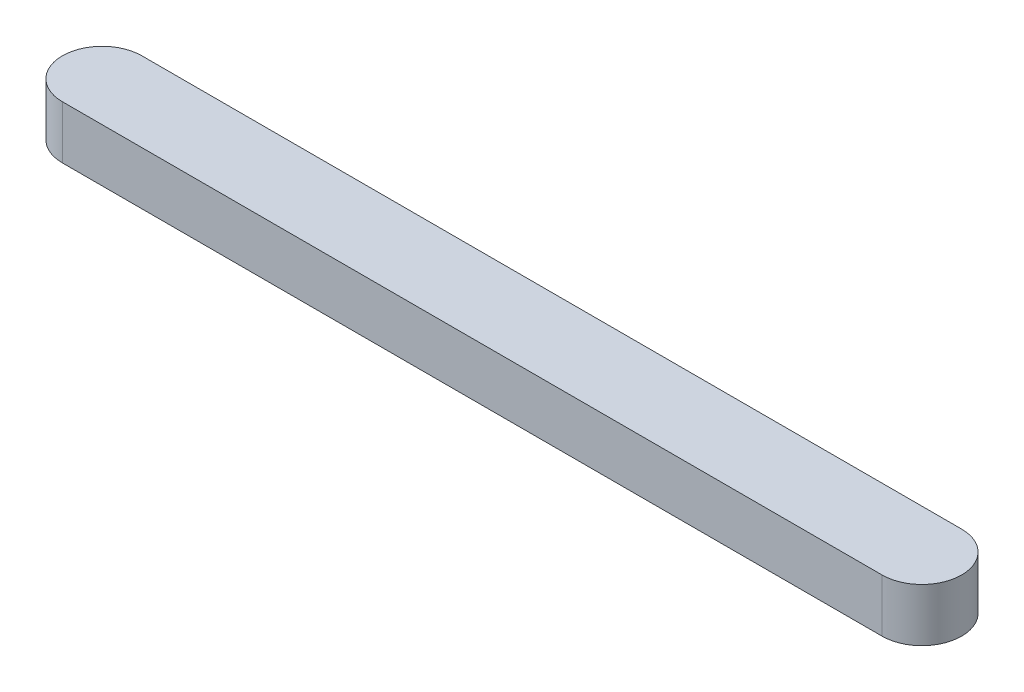
ISO-10303-21;
HEADER;
FILE_DESCRIPTION(('STEP AP214'),'2;1');
FILE_NAME('part.step','',(''),(''),'','','');
FILE_SCHEMA(('AUTOMOTIVE_DESIGN { 1 0 10303 214 1 1 1 1 }'));
ENDSEC;
DATA;
#1=APPLICATION_CONTEXT('core data for automotive mechanical design processes');
#2=APPLICATION_PROTOCOL_DEFINITION('international standard','automotive_design',2000,#1);
#3=PRODUCT_CONTEXT('',#1,'mechanical');
#4=PRODUCT('Part','Part','',(#3));
#5=PRODUCT_RELATED_PRODUCT_CATEGORY('part','',(#4));
#6=PRODUCT_DEFINITION_FORMATION('','',#4);
#7=PRODUCT_DEFINITION_CONTEXT('part definition',#1,'design');
#8=PRODUCT_DEFINITION('design','',#6,#7);
#9=PRODUCT_DEFINITION_SHAPE('','',#8);
#10=(LENGTH_UNIT() NAMED_UNIT(*) SI_UNIT(.MILLI.,.METRE.));
#11=(NAMED_UNIT(*) PLANE_ANGLE_UNIT() SI_UNIT($,.RADIAN.));
#12=(NAMED_UNIT(*) SI_UNIT($,.STERADIAN.) SOLID_ANGLE_UNIT());
#13=UNCERTAINTY_MEASURE_WITH_UNIT(LENGTH_MEASURE(1.E-05),#10,'distance_accuracy_value','');
#14=(GEOMETRIC_REPRESENTATION_CONTEXT(3) GLOBAL_UNCERTAINTY_ASSIGNED_CONTEXT((#13)) GLOBAL_UNIT_ASSIGNED_CONTEXT((#10,
#11,#12)) REPRESENTATION_CONTEXT('',''));
#15=CARTESIAN_POINT('',(0.,0.,0.));
#16=DIRECTION('',(0.,0.,1.));
#17=DIRECTION('',(1.,0.,0.));
#18=AXIS2_PLACEMENT_3D('',#15,#16,#17);
#19=CARTESIAN_POINT('',(-30.925,4.,0.));
#20=DIRECTION('',(0.,-1.,0.));
#21=DIRECTION('',(0.,0.,-1.));
#22=AXIS2_PLACEMENT_3D('',#19,#20,#21);
#23=CYLINDRICAL_SURFACE('',#22,3.);
#24=CARTESIAN_POINT('',(-30.925,0.,0.));
#25=DIRECTION('',(0.,1.,0.));
#26=DIRECTION('',(0.,0.,1.));
#27=AXIS2_PLACEMENT_3D('',#24,#25,#26);
#28=CIRCLE('',#27,3.);
#29=CARTESIAN_POINT('',(-30.925,0.,-3.));
#30=VERTEX_POINT('',#29);
#31=CARTESIAN_POINT('',(-30.925,0.,3.));
#32=VERTEX_POINT('',#31);
#33=EDGE_CURVE('E107',#30,#32,#28,.T.);
#34=ORIENTED_EDGE('',*,*,#33,.T.);
#35=DIRECTION('',(0.,-1.,0.));
#36=VECTOR('',#35,1.);
#37=CARTESIAN_POINT('',(-30.925,4.,3.));
#38=LINE('',#37,#36);
#39=CARTESIAN_POINT('',(-30.925,4.,3.));
#40=VERTEX_POINT('',#39);
#41=EDGE_CURVE('E11',#40,#32,#38,.T.);
#42=ORIENTED_EDGE('',*,*,#41,.F.);
#43=CARTESIAN_POINT('',(-30.925,4.,0.));
#44=DIRECTION('',(0.,1.,0.));
#45=DIRECTION('',(0.,0.,1.));
#46=AXIS2_PLACEMENT_3D('',#43,#44,#45);
#47=CIRCLE('',#46,3.);
#48=CARTESIAN_POINT('',(-30.925,4.,-3.));
#49=VERTEX_POINT('',#48);
#50=EDGE_CURVE('E91',#49,#40,#47,.T.);
#51=ORIENTED_EDGE('',*,*,#50,.F.);
#52=DIRECTION('',(0.,-1.,0.));
#53=VECTOR('',#52,1.);
#54=CARTESIAN_POINT('',(-30.925,4.,-3.));
#55=LINE('',#54,#53);
#56=EDGE_CURVE('E103',#49,#30,#55,.T.);
#57=ORIENTED_EDGE('',*,*,#56,.T.);
#58=EDGE_LOOP('',(#34,#42,#51,#57));
#59=FACE_BOUND('',#58,.T.);
#60=ADVANCED_FACE('F39',(#59),#23,.T.);
#61=CARTESIAN_POINT('',(-30.925,4.,3.));
#62=DIRECTION('',(0.,0.,-1.));
#63=DIRECTION('',(-1.,0.,0.));
#64=AXIS2_PLACEMENT_3D('',#61,#62,#63);
#65=PLANE('',#64);
#66=DIRECTION('',(1.,0.,0.));
#67=VECTOR('',#66,1.);
#68=CARTESIAN_POINT('',(-30.925,0.,3.));
#69=LINE('',#68,#67);
#70=CARTESIAN_POINT('',(30.925,0.,3.));
#71=VERTEX_POINT('',#70);
#72=EDGE_CURVE('E96',#32,#71,#69,.T.);
#73=ORIENTED_EDGE('',*,*,#72,.T.);
#74=DIRECTION('',(0.,-1.,0.));
#75=VECTOR('',#74,1.);
#76=CARTESIAN_POINT('',(30.925,4.,3.));
#77=LINE('',#76,#75);
#78=CARTESIAN_POINT('',(30.925,4.,3.));
#79=VERTEX_POINT('',#78);
#80=EDGE_CURVE('E48',#79,#71,#77,.T.);
#81=ORIENTED_EDGE('',*,*,#80,.F.);
#82=DIRECTION('',(1.,0.,0.));
#83=VECTOR('',#82,1.);
#84=CARTESIAN_POINT('',(-30.925,4.,3.));
#85=LINE('',#84,#83);
#86=EDGE_CURVE('E86',#40,#79,#85,.T.);
#87=ORIENTED_EDGE('',*,*,#86,.F.);
#88=ORIENTED_EDGE('',*,*,#41,.T.);
#89=EDGE_LOOP('',(#73,#81,#87,#88));
#90=FACE_BOUND('',#89,.T.);
#91=ADVANCED_FACE('F95',(#90),#65,.F.);
#92=CARTESIAN_POINT('',(30.925,4.,0.));
#93=DIRECTION('',(0.,-1.,0.));
#94=DIRECTION('',(0.,0.,-1.));
#95=AXIS2_PLACEMENT_3D('',#92,#93,#94);
#96=CYLINDRICAL_SURFACE('',#95,3.);
#97=CARTESIAN_POINT('',(30.925,0.,0.));
#98=DIRECTION('',(0.,1.,0.));
#99=DIRECTION('',(0.,0.,1.));
#100=AXIS2_PLACEMENT_3D('',#97,#98,#99);
#101=CIRCLE('',#100,3.);
#102=CARTESIAN_POINT('',(30.925,0.,-3.));
#103=VERTEX_POINT('',#102);
#104=EDGE_CURVE('E73',#71,#103,#101,.T.);
#105=ORIENTED_EDGE('',*,*,#104,.T.);
#106=DIRECTION('',(0.,-1.,0.));
#107=VECTOR('',#106,1.);
#108=CARTESIAN_POINT('',(30.925,4.,-3.));
#109=LINE('',#108,#107);
#110=CARTESIAN_POINT('',(30.925,4.,-3.));
#111=VERTEX_POINT('',#110);
#112=EDGE_CURVE('E98',#111,#103,#109,.T.);
#113=ORIENTED_EDGE('',*,*,#112,.F.);
#114=CARTESIAN_POINT('',(30.925,4.,0.));
#115=DIRECTION('',(0.,1.,0.));
#116=DIRECTION('',(0.,0.,1.));
#117=AXIS2_PLACEMENT_3D('',#114,#115,#116);
#118=CIRCLE('',#117,3.);
#119=EDGE_CURVE('E89',#79,#111,#118,.T.);
#120=ORIENTED_EDGE('',*,*,#119,.F.);
#121=ORIENTED_EDGE('',*,*,#80,.T.);
#122=EDGE_LOOP('',(#105,#113,#120,#121));
#123=FACE_BOUND('',#122,.T.);
#124=ADVANCED_FACE('F99',(#123),#96,.T.);
#125=CARTESIAN_POINT('',(-30.925,4.,-3.));
#126=DIRECTION('',(0.,0.,1.));
#127=DIRECTION('',(1.,0.,0.));
#128=AXIS2_PLACEMENT_3D('',#125,#126,#127);
#129=PLANE('',#128);
#130=DIRECTION('',(-1.,0.,0.));
#131=VECTOR('',#130,1.);
#132=CARTESIAN_POINT('',(-30.925,0.,-3.));
#133=LINE('',#132,#131);
#134=EDGE_CURVE('E79',#103,#30,#133,.T.);
#135=ORIENTED_EDGE('',*,*,#134,.T.);
#136=ORIENTED_EDGE('',*,*,#56,.F.);
#137=DIRECTION('',(-1.,0.,0.));
#138=VECTOR('',#137,1.);
#139=CARTESIAN_POINT('',(-30.925,4.,-3.));
#140=LINE('',#139,#138);
#141=EDGE_CURVE('E56',#111,#49,#140,.T.);
#142=ORIENTED_EDGE('',*,*,#141,.F.);
#143=ORIENTED_EDGE('',*,*,#112,.T.);
#144=EDGE_LOOP('',(#135,#136,#142,#143));
#145=FACE_BOUND('',#144,.T.);
#146=ADVANCED_FACE('F120',(#145),#129,.F.);
#147=CARTESIAN_POINT('',(-30.925,4.,0.));
#148=DIRECTION('',(0.,1.,0.));
#149=DIRECTION('',(0.,0.,1.));
#150=AXIS2_PLACEMENT_3D('',#147,#148,#149);
#151=PLANE('',#150);
#152=ORIENTED_EDGE('',*,*,#50,.T.);
#153=ORIENTED_EDGE('',*,*,#86,.T.);
#154=ORIENTED_EDGE('',*,*,#119,.T.);
#155=ORIENTED_EDGE('',*,*,#141,.T.);
#156=EDGE_LOOP('',(#152,#153,#154,#155));
#157=FACE_BOUND('',#156,.T.);
#158=ADVANCED_FACE('F87',(#157),#151,.T.);
#159=CARTESIAN_POINT('',(-30.925,0.,0.));
#160=DIRECTION('',(0.,1.,0.));
#161=DIRECTION('',(0.,0.,1.));
#162=AXIS2_PLACEMENT_3D('',#159,#160,#161);
#163=PLANE('',#162);
#164=ORIENTED_EDGE('',*,*,#33,.F.);
#165=ORIENTED_EDGE('',*,*,#134,.F.);
#166=ORIENTED_EDGE('',*,*,#104,.F.);
#167=ORIENTED_EDGE('',*,*,#72,.F.);
#168=EDGE_LOOP('',(#164,#165,#166,#167));
#169=FACE_BOUND('',#168,.T.);
#170=ADVANCED_FACE('F123',(#169),#163,.F.);
#171=CLOSED_SHELL('',(#60,#91,#124,#146,#158,#170));
#172=MANIFOLD_SOLID_BREP('B2',#171);
#173=ADVANCED_BREP_SHAPE_REPRESENTATION('',(#18,#172),#14);
#174=SHAPE_DEFINITION_REPRESENTATION(#9,#173);
ENDSEC;
END-ISO-10303-21;
